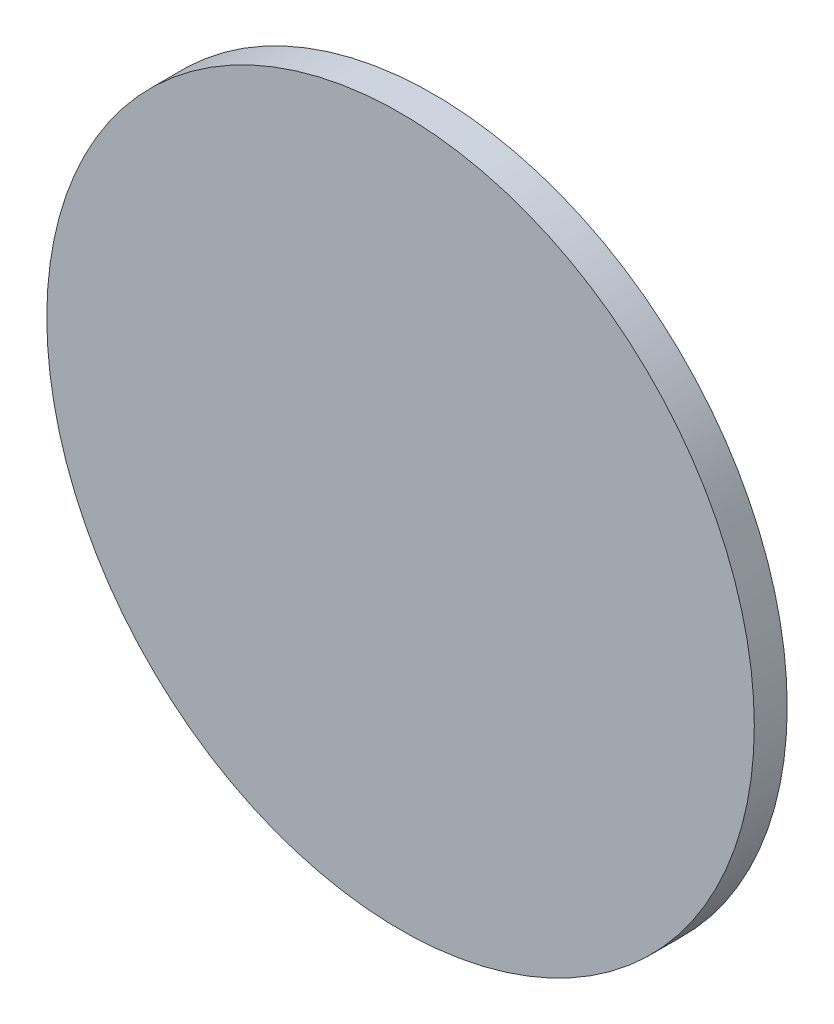
ISO-10303-21;
HEADER;
FILE_DESCRIPTION(('STEP AP214'),'2;1');
FILE_NAME('part.step','',(''),(''),'','','');
FILE_SCHEMA(('AUTOMOTIVE_DESIGN { 1 0 10303 214 1 1 1 1 }'));
ENDSEC;
DATA;
#1=APPLICATION_CONTEXT('core data for automotive mechanical design processes');
#2=APPLICATION_PROTOCOL_DEFINITION('international standard','automotive_design',2000,#1);
#3=PRODUCT_CONTEXT('',#1,'mechanical');
#4=PRODUCT('Part','Part','',(#3));
#5=PRODUCT_RELATED_PRODUCT_CATEGORY('part','',(#4));
#6=PRODUCT_DEFINITION_FORMATION('','',#4);
#7=PRODUCT_DEFINITION_CONTEXT('part definition',#1,'design');
#8=PRODUCT_DEFINITION('design','',#6,#7);
#9=PRODUCT_DEFINITION_SHAPE('','',#8);
#10=(LENGTH_UNIT() NAMED_UNIT(*) SI_UNIT(.MILLI.,.METRE.));
#11=(NAMED_UNIT(*) PLANE_ANGLE_UNIT() SI_UNIT($,.RADIAN.));
#12=(NAMED_UNIT(*) SI_UNIT($,.STERADIAN.) SOLID_ANGLE_UNIT());
#13=UNCERTAINTY_MEASURE_WITH_UNIT(LENGTH_MEASURE(1.E-05),#10,'distance_accuracy_value','');
#14=(GEOMETRIC_REPRESENTATION_CONTEXT(3) GLOBAL_UNCERTAINTY_ASSIGNED_CONTEXT((#13)) GLOBAL_UNIT_ASSIGNED_CONTEXT((#10,
#11,#12)) REPRESENTATION_CONTEXT('',''));
#15=CARTESIAN_POINT('',(0.,0.,0.));
#16=DIRECTION('',(0.,0.,1.));
#17=DIRECTION('',(1.,0.,0.));
#18=AXIS2_PLACEMENT_3D('',#15,#16,#17);
#19=CARTESIAN_POINT('',(0.,0.,10.));
#20=DIRECTION('',(0.,0.,-1.));
#21=DIRECTION('',(-1.,0.,0.));
#22=AXIS2_PLACEMENT_3D('',#19,#20,#21);
#23=CYLINDRICAL_SURFACE('',#22,107.5);
#24=CARTESIAN_POINT('',(0.,0.,10.));
#25=DIRECTION('',(0.,0.,1.));
#26=DIRECTION('',(1.,0.,0.));
#27=AXIS2_PLACEMENT_3D('',#24,#25,#26);
#28=CIRCLE('',#27,107.5);
#29=CARTESIAN_POINT('',(107.5,0.,10.));
#30=VERTEX_POINT('',#29);
#31=EDGE_CURVE('E10',#30,#30,#28,.T.);
#32=ORIENTED_EDGE('',*,*,#31,.F.);
#33=EDGE_LOOP('',(#32));
#34=FACE_BOUND('',#33,.T.);
#35=CARTESIAN_POINT('',(0.,0.,0.));
#36=DIRECTION('',(0.,0.,1.));
#37=DIRECTION('',(1.,0.,0.));
#38=AXIS2_PLACEMENT_3D('',#35,#36,#37);
#39=CIRCLE('',#38,107.5);
#40=CARTESIAN_POINT('',(107.5,0.,0.));
#41=VERTEX_POINT('',#40);
#42=EDGE_CURVE('E34',#41,#41,#39,.T.);
#43=ORIENTED_EDGE('',*,*,#42,.T.);
#44=EDGE_LOOP('',(#43));
#45=FACE_BOUND('',#44,.T.);
#46=ADVANCED_FACE('F31',(#34,#45),#23,.T.);
#47=CARTESIAN_POINT('',(0.,0.,10.));
#48=DIRECTION('',(0.,0.,1.));
#49=DIRECTION('',(1.,0.,0.));
#50=AXIS2_PLACEMENT_3D('',#47,#48,#49);
#51=PLANE('',#50);
#52=ORIENTED_EDGE('',*,*,#31,.T.);
#53=EDGE_LOOP('',(#52));
#54=FACE_BOUND('',#53,.T.);
#55=ADVANCED_FACE('F46',(#54),#51,.T.);
#56=CARTESIAN_POINT('',(0.,0.,0.));
#57=DIRECTION('',(0.,0.,1.));
#58=DIRECTION('',(1.,0.,0.));
#59=AXIS2_PLACEMENT_3D('',#56,#57,#58);
#60=PLANE('',#59);
#61=ORIENTED_EDGE('',*,*,#42,.F.);
#62=EDGE_LOOP('',(#61));
#63=FACE_BOUND('',#62,.T.);
#64=ADVANCED_FACE('F44',(#63),#60,.F.);
#65=CLOSED_SHELL('',(#46,#55,#64));
#66=MANIFOLD_SOLID_BREP('B2',#65);
#67=ADVANCED_BREP_SHAPE_REPRESENTATION('',(#18,#66),#14);
#68=SHAPE_DEFINITION_REPRESENTATION(#9,#67);
ENDSEC;
END-ISO-10303-21;
